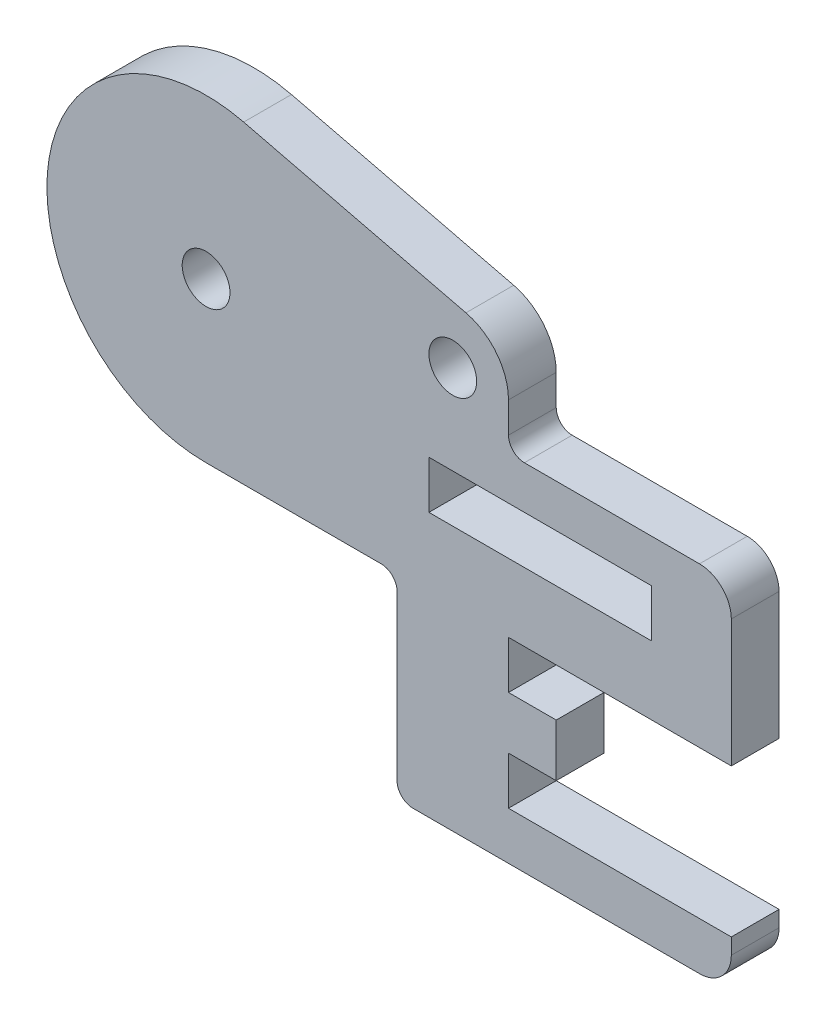
ISO-10303-21;
HEADER;
FILE_DESCRIPTION(('STEP AP214'),'2;1');
FILE_NAME('part.step','',(''),(''),'','','');
FILE_SCHEMA(('AUTOMOTIVE_DESIGN { 1 0 10303 214 1 1 1 1 }'));
ENDSEC;
DATA;
#1=APPLICATION_CONTEXT('core data for automotive mechanical design processes');
#2=APPLICATION_PROTOCOL_DEFINITION('international standard','automotive_design',2000,#1);
#3=PRODUCT_CONTEXT('',#1,'mechanical');
#4=PRODUCT('Part','Part','',(#3));
#5=PRODUCT_RELATED_PRODUCT_CATEGORY('part','',(#4));
#6=PRODUCT_DEFINITION_FORMATION('','',#4);
#7=PRODUCT_DEFINITION_CONTEXT('part definition',#1,'design');
#8=PRODUCT_DEFINITION('design','',#6,#7);
#9=PRODUCT_DEFINITION_SHAPE('','',#8);
#10=(LENGTH_UNIT() NAMED_UNIT(*) SI_UNIT(.MILLI.,.METRE.));
#11=(NAMED_UNIT(*) PLANE_ANGLE_UNIT() SI_UNIT($,.RADIAN.));
#12=(NAMED_UNIT(*) SI_UNIT($,.STERADIAN.) SOLID_ANGLE_UNIT());
#13=UNCERTAINTY_MEASURE_WITH_UNIT(LENGTH_MEASURE(1.E-05),#10,'distance_accuracy_value','');
#14=(GEOMETRIC_REPRESENTATION_CONTEXT(3) GLOBAL_UNCERTAINTY_ASSIGNED_CONTEXT((#13)) GLOBAL_UNIT_ASSIGNED_CONTEXT((#10,
#11,#12)) REPRESENTATION_CONTEXT('',''));
#15=CARTESIAN_POINT('',(0.,0.,0.));
#16=DIRECTION('',(0.,0.,1.));
#17=DIRECTION('',(1.,0.,0.));
#18=AXIS2_PLACEMENT_3D('',#15,#16,#17);
#19=CARTESIAN_POINT('',(3.8221752825364,-5.14990031947539,3.));
#20=DIRECTION('',(-1.,0.,0.));
#21=DIRECTION('',(0.,-1.,0.));
#22=AXIS2_PLACEMENT_3D('',#19,#20,#21);
#23=PLANE('',#22);
#24=DIRECTION('',(0.,1.,0.));
#25=VECTOR('',#24,1.);
#26=CARTESIAN_POINT('',(3.8221752825364,-5.14990031947539,0.));
#27=LINE('',#26,#25);
#28=CARTESIAN_POINT('',(3.8221752825364,-23.4499003194754,0.));
#29=VERTEX_POINT('',#28);
#30=CARTESIAN_POINT('',(3.8221752825364,-22.4499003194754,0.));
#31=VERTEX_POINT('',#30);
#32=EDGE_CURVE('E333',#29,#31,#27,.T.);
#33=ORIENTED_EDGE('',*,*,#32,.T.);
#34=DIRECTION('',(0.,0.,1.));
#35=VECTOR('',#34,1.);
#36=CARTESIAN_POINT('',(3.8221752825364,-22.4499003194754,0.));
#37=LINE('',#36,#35);
#38=CARTESIAN_POINT('',(3.8221752825364,-22.4499003194754,3.));
#39=VERTEX_POINT('',#38);
#40=EDGE_CURVE('E554',#31,#39,#37,.T.);
#41=ORIENTED_EDGE('',*,*,#40,.T.);
#42=DIRECTION('',(0.,1.,0.));
#43=VECTOR('',#42,1.);
#44=CARTESIAN_POINT('',(3.8221752825364,-5.14990031947539,3.));
#45=LINE('',#44,#43);
#46=CARTESIAN_POINT('',(3.8221752825364,-23.4499003194754,3.));
#47=VERTEX_POINT('',#46);
#48=EDGE_CURVE('E288',#47,#39,#45,.T.);
#49=ORIENTED_EDGE('',*,*,#48,.F.);
#50=DIRECTION('',(0.,0.,-1.));
#51=VECTOR('',#50,1.);
#52=CARTESIAN_POINT('',(3.8221752825364,-23.4499003194754,3.));
#53=LINE('',#52,#51);
#54=EDGE_CURVE('E381',#47,#29,#53,.T.);
#55=ORIENTED_EDGE('',*,*,#54,.T.);
#56=EDGE_LOOP('',(#33,#41,#49,#55));
#57=FACE_BOUND('',#56,.T.);
#58=ADVANCED_FACE('F44',(#57),#23,.F.);
#59=CARTESIAN_POINT('',(-29.1778247174636,-3.14990031947539,3.));
#60=DIRECTION('',(0.,0.,-1.));
#61=DIRECTION('',(-1.,0.,0.));
#62=AXIS2_PLACEMENT_3D('',#59,#60,#61);
#63=CYLINDRICAL_SURFACE('',#62,10.);
#64=CARTESIAN_POINT('',(-29.1778247174636,-3.14990031947539,0.));
#65=DIRECTION('',(0.,0.,1.));
#66=DIRECTION('',(1.,0.,0.));
#67=AXIS2_PLACEMENT_3D('',#64,#65,#66);
#68=CIRCLE('',#67,10.);
#69=CARTESIAN_POINT('',(-26.8147949891367,6.56689393084417,0.));
#70=VERTEX_POINT('',#69);
#71=CARTESIAN_POINT('',(-29.1778247174636,-13.1499003194754,0.));
#72=VERTEX_POINT('',#71);
#73=EDGE_CURVE('E258',#70,#72,#68,.T.);
#74=ORIENTED_EDGE('',*,*,#73,.T.);
#75=DIRECTION('',(0.,0.,-1.));
#76=VECTOR('',#75,1.);
#77=CARTESIAN_POINT('',(-29.1778247174636,-13.1499003194754,3.));
#78=LINE('',#77,#76);
#79=CARTESIAN_POINT('',(-29.1778247174636,-13.1499003194754,3.));
#80=VERTEX_POINT('',#79);
#81=EDGE_CURVE('E11',#80,#72,#78,.T.);
#82=ORIENTED_EDGE('',*,*,#81,.F.);
#83=CARTESIAN_POINT('',(-29.1778247174636,-3.14990031947539,3.));
#84=DIRECTION('',(0.,0.,1.));
#85=DIRECTION('',(1.,0.,0.));
#86=AXIS2_PLACEMENT_3D('',#83,#84,#85);
#87=CIRCLE('',#86,10.);
#88=CARTESIAN_POINT('',(-26.8147949891367,6.56689393084417,3.));
#89=VERTEX_POINT('',#88);
#90=EDGE_CURVE('E264',#89,#80,#87,.T.);
#91=ORIENTED_EDGE('',*,*,#90,.F.);
#92=DIRECTION('',(0.,0.,-1.));
#93=VECTOR('',#92,1.);
#94=CARTESIAN_POINT('',(-26.8147949891367,6.56689393084417,3.));
#95=LINE('',#94,#93);
#96=EDGE_CURVE('E310',#89,#70,#95,.T.);
#97=ORIENTED_EDGE('',*,*,#96,.T.);
#98=EDGE_LOOP('',(#74,#82,#91,#97));
#99=FACE_BOUND('',#98,.T.);
#100=ADVANCED_FACE('F46',(#99),#63,.T.);
#101=CARTESIAN_POINT('',(-29.1778247174636,-13.1499003194754,3.));
#102=DIRECTION('',(0.,1.,0.));
#103=DIRECTION('',(0.,0.,1.));
#104=AXIS2_PLACEMENT_3D('',#101,#102,#103);
#105=PLANE('',#104);
#106=DIRECTION('',(1.,0.,0.));
#107=VECTOR('',#106,1.);
#108=CARTESIAN_POINT('',(-29.1778247174636,-13.1499003194754,0.));
#109=LINE('',#108,#107);
#110=CARTESIAN_POINT('',(-18.1778247174636,-13.1499003194754,0.));
#111=VERTEX_POINT('',#110);
#112=EDGE_CURVE('E314',#72,#111,#109,.T.);
#113=ORIENTED_EDGE('',*,*,#112,.T.);
#114=DIRECTION('',(0.,0.,-1.));
#115=VECTOR('',#114,1.);
#116=CARTESIAN_POINT('',(-18.1778247174636,-13.1499003194754,3.));
#117=LINE('',#116,#115);
#118=CARTESIAN_POINT('',(-18.1778247174636,-13.1499003194754,3.));
#119=VERTEX_POINT('',#118);
#120=EDGE_CURVE('E53',#119,#111,#117,.T.);
#121=ORIENTED_EDGE('',*,*,#120,.F.);
#122=DIRECTION('',(1.,0.,0.));
#123=VECTOR('',#122,1.);
#124=CARTESIAN_POINT('',(-29.1778247174636,-13.1499003194754,3.));
#125=LINE('',#124,#123);
#126=EDGE_CURVE('E268',#80,#119,#125,.T.);
#127=ORIENTED_EDGE('',*,*,#126,.F.);
#128=ORIENTED_EDGE('',*,*,#81,.T.);
#129=EDGE_LOOP('',(#113,#121,#127,#128));
#130=FACE_BOUND('',#129,.T.);
#131=ADVANCED_FACE('F428',(#130),#105,.F.);
#132=CARTESIAN_POINT('',(-18.1778247174636,-14.1499003194754,3.));
#133=DIRECTION('',(0.,0.,-1.));
#134=DIRECTION('',(-1.,0.,0.));
#135=AXIS2_PLACEMENT_3D('',#132,#133,#134);
#136=CYLINDRICAL_SURFACE('',#135,1.);
#137=CARTESIAN_POINT('',(-18.1778247174636,-14.1499003194754,0.));
#138=DIRECTION('',(0.,0.,-1.));
#139=DIRECTION('',(-1.,0.,0.));
#140=AXIS2_PLACEMENT_3D('',#137,#138,#139);
#141=CIRCLE('',#140,1.);
#142=CARTESIAN_POINT('',(-17.1778247174636,-14.1499003194754,0.));
#143=VERTEX_POINT('',#142);
#144=EDGE_CURVE('E317',#111,#143,#141,.T.);
#145=ORIENTED_EDGE('',*,*,#144,.T.);
#146=DIRECTION('',(0.,0.,-1.));
#147=VECTOR('',#146,1.);
#148=CARTESIAN_POINT('',(-17.1778247174636,-14.1499003194754,3.));
#149=LINE('',#148,#147);
#150=CARTESIAN_POINT('',(-17.1778247174636,-14.1499003194754,3.));
#151=VERTEX_POINT('',#150);
#152=EDGE_CURVE('E397',#151,#143,#149,.T.);
#153=ORIENTED_EDGE('',*,*,#152,.F.);
#154=CARTESIAN_POINT('',(-18.1778247174636,-14.1499003194754,3.));
#155=DIRECTION('',(0.,0.,-1.));
#156=DIRECTION('',(-1.,0.,0.));
#157=AXIS2_PLACEMENT_3D('',#154,#155,#156);
#158=CIRCLE('',#157,1.);
#159=EDGE_CURVE('E272',#119,#151,#158,.T.);
#160=ORIENTED_EDGE('',*,*,#159,.F.);
#161=ORIENTED_EDGE('',*,*,#120,.T.);
#162=EDGE_LOOP('',(#145,#153,#160,#161));
#163=FACE_BOUND('',#162,.T.);
#164=ADVANCED_FACE('F406',(#163),#136,.F.);
#165=CARTESIAN_POINT('',(-17.1778247174636,-24.4499003194754,3.));
#166=DIRECTION('',(1.,0.,0.));
#167=DIRECTION('',(0.,0.,-1.));
#168=AXIS2_PLACEMENT_3D('',#165,#166,#167);
#169=PLANE('',#168);
#170=DIRECTION('',(0.,-1.,0.));
#171=VECTOR('',#170,1.);
#172=CARTESIAN_POINT('',(-17.1778247174636,-24.4499003194754,0.));
#173=LINE('',#172,#171);
#174=CARTESIAN_POINT('',(-17.1778247174636,-24.4499003194754,0.));
#175=VERTEX_POINT('',#174);
#176=EDGE_CURVE('E320',#143,#175,#173,.T.);
#177=ORIENTED_EDGE('',*,*,#176,.T.);
#178=DIRECTION('',(0.,0.,-1.));
#179=VECTOR('',#178,1.);
#180=CARTESIAN_POINT('',(-17.1778247174636,-24.4499003194754,3.));
#181=LINE('',#180,#179);
#182=CARTESIAN_POINT('',(-17.1778247174636,-24.4499003194754,3.));
#183=VERTEX_POINT('',#182);
#184=EDGE_CURVE('E393',#183,#175,#181,.T.);
#185=ORIENTED_EDGE('',*,*,#184,.F.);
#186=DIRECTION('',(0.,-1.,0.));
#187=VECTOR('',#186,1.);
#188=CARTESIAN_POINT('',(-17.1778247174636,-24.4499003194754,3.));
#189=LINE('',#188,#187);
#190=EDGE_CURVE('E275',#151,#183,#189,.T.);
#191=ORIENTED_EDGE('',*,*,#190,.F.);
#192=ORIENTED_EDGE('',*,*,#152,.T.);
#193=EDGE_LOOP('',(#177,#185,#191,#192));
#194=FACE_BOUND('',#193,.T.);
#195=ADVANCED_FACE('F415',(#194),#169,.F.);
#196=CARTESIAN_POINT('',(-16.1778247174636,-24.4499003194754,3.));
#197=DIRECTION('',(0.,0.,-1.));
#198=DIRECTION('',(-1.,0.,0.));
#199=AXIS2_PLACEMENT_3D('',#196,#197,#198);
#200=CYLINDRICAL_SURFACE('',#199,1.);
#201=CARTESIAN_POINT('',(-16.1778247174636,-24.4499003194754,0.));
#202=DIRECTION('',(0.,0.,1.));
#203=DIRECTION('',(1.,0.,0.));
#204=AXIS2_PLACEMENT_3D('',#201,#202,#203);
#205=CIRCLE('',#204,1.);
#206=CARTESIAN_POINT('',(-16.1778247174636,-25.4499003194754,0.));
#207=VERTEX_POINT('',#206);
#208=EDGE_CURVE('E323',#175,#207,#205,.T.);
#209=ORIENTED_EDGE('',*,*,#208,.T.);
#210=DIRECTION('',(0.,0.,-1.));
#211=VECTOR('',#210,1.);
#212=CARTESIAN_POINT('',(-16.1778247174636,-25.4499003194754,3.));
#213=LINE('',#212,#211);
#214=CARTESIAN_POINT('',(-16.1778247174636,-25.4499003194754,3.));
#215=VERTEX_POINT('',#214);
#216=EDGE_CURVE('E389',#215,#207,#213,.T.);
#217=ORIENTED_EDGE('',*,*,#216,.F.);
#218=CARTESIAN_POINT('',(-16.1778247174636,-24.4499003194754,3.));
#219=DIRECTION('',(0.,0.,1.));
#220=DIRECTION('',(1.,0.,0.));
#221=AXIS2_PLACEMENT_3D('',#218,#219,#220);
#222=CIRCLE('',#221,1.);
#223=EDGE_CURVE('E278',#183,#215,#222,.T.);
#224=ORIENTED_EDGE('',*,*,#223,.F.);
#225=ORIENTED_EDGE('',*,*,#184,.T.);
#226=EDGE_LOOP('',(#209,#217,#224,#225));
#227=FACE_BOUND('',#226,.T.);
#228=ADVANCED_FACE('F419',(#227),#200,.T.);
#229=CARTESIAN_POINT('',(1.8221752825364,-25.4499003194754,3.));
#230=DIRECTION('',(0.,1.,0.));
#231=DIRECTION('',(-1.,0.,0.));
#232=AXIS2_PLACEMENT_3D('',#229,#230,#231);
#233=PLANE('',#232);
#234=DIRECTION('',(1.,0.,0.));
#235=VECTOR('',#234,1.);
#236=CARTESIAN_POINT('',(1.8221752825364,-25.4499003194754,0.));
#237=LINE('',#236,#235);
#238=CARTESIAN_POINT('',(1.8221752825364,-25.4499003194754,0.));
#239=VERTEX_POINT('',#238);
#240=EDGE_CURVE('E326',#207,#239,#237,.T.);
#241=ORIENTED_EDGE('',*,*,#240,.T.);
#242=DIRECTION('',(0.,0.,-1.));
#243=VECTOR('',#242,1.);
#244=CARTESIAN_POINT('',(1.8221752825364,-25.4499003194754,3.));
#245=LINE('',#244,#243);
#246=CARTESIAN_POINT('',(1.8221752825364,-25.4499003194754,3.));
#247=VERTEX_POINT('',#246);
#248=EDGE_CURVE('E385',#247,#239,#245,.T.);
#249=ORIENTED_EDGE('',*,*,#248,.F.);
#250=DIRECTION('',(1.,0.,0.));
#251=VECTOR('',#250,1.);
#252=CARTESIAN_POINT('',(1.8221752825364,-25.4499003194754,3.));
#253=LINE('',#252,#251);
#254=EDGE_CURVE('E281',#215,#247,#253,.T.);
#255=ORIENTED_EDGE('',*,*,#254,.F.);
#256=ORIENTED_EDGE('',*,*,#216,.T.);
#257=EDGE_LOOP('',(#241,#249,#255,#256));
#258=FACE_BOUND('',#257,.T.);
#259=ADVANCED_FACE('F611',(#258),#233,.F.);
#260=CARTESIAN_POINT('',(1.8221752825364,-23.4499003194754,3.));
#261=DIRECTION('',(0.,0.,-1.));
#262=DIRECTION('',(-1.,0.,0.));
#263=AXIS2_PLACEMENT_3D('',#260,#261,#262);
#264=CYLINDRICAL_SURFACE('',#263,2.);
#265=CARTESIAN_POINT('',(1.8221752825364,-23.4499003194754,0.));
#266=DIRECTION('',(0.,0.,1.));
#267=DIRECTION('',(-1.,0.,0.));
#268=AXIS2_PLACEMENT_3D('',#265,#266,#267);
#269=CIRCLE('',#268,2.);
#270=EDGE_CURVE('E329',#239,#29,#269,.T.);
#271=ORIENTED_EDGE('',*,*,#270,.T.);
#272=ORIENTED_EDGE('',*,*,#54,.F.);
#273=CARTESIAN_POINT('',(1.8221752825364,-23.4499003194754,3.));
#274=DIRECTION('',(0.,0.,1.));
#275=DIRECTION('',(-1.,0.,0.));
#276=AXIS2_PLACEMENT_3D('',#273,#274,#275);
#277=CIRCLE('',#276,2.);
#278=EDGE_CURVE('E284',#247,#47,#277,.T.);
#279=ORIENTED_EDGE('',*,*,#278,.F.);
#280=ORIENTED_EDGE('',*,*,#248,.T.);
#281=EDGE_LOOP('',(#271,#272,#279,#280));
#282=FACE_BOUND('',#281,.T.);
#283=ADVANCED_FACE('F605',(#282),#264,.T.);
#284=CARTESIAN_POINT('',(3.8221752825364,-13.1499003194754,3.));
#285=VERTEX_POINT('',#284);
#286=CARTESIAN_POINT('',(3.8221752825364,-5.14990031947539,3.));
#287=VERTEX_POINT('',#286);
#288=EDGE_CURVE('E287',#285,#287,#45,.T.);
#289=ORIENTED_EDGE('',*,*,#288,.F.);
#290=DIRECTION('',(0.,0.,1.));
#291=VECTOR('',#290,1.);
#292=CARTESIAN_POINT('',(3.8221752825364,-13.1499003194754,0.));
#293=LINE('',#292,#291);
#294=CARTESIAN_POINT('',(3.8221752825364,-13.1499003194754,0.));
#295=VERTEX_POINT('',#294);
#296=EDGE_CURVE('E527',#295,#285,#293,.T.);
#297=ORIENTED_EDGE('',*,*,#296,.F.);
#298=CARTESIAN_POINT('',(3.8221752825364,-5.14990031947539,0.));
#299=VERTEX_POINT('',#298);
#300=EDGE_CURVE('E332',#295,#299,#27,.T.);
#301=ORIENTED_EDGE('',*,*,#300,.T.);
#302=DIRECTION('',(0.,0.,-1.));
#303=VECTOR('',#302,1.);
#304=CARTESIAN_POINT('',(3.8221752825364,-5.14990031947539,3.));
#305=LINE('',#304,#303);
#306=EDGE_CURVE('E377',#287,#299,#305,.T.);
#307=ORIENTED_EDGE('',*,*,#306,.F.);
#308=EDGE_LOOP('',(#289,#297,#301,#307));
#309=FACE_BOUND('',#308,.T.);
#310=ADVANCED_FACE('F583',(#309),#23,.F.);
#311=CARTESIAN_POINT('',(1.8221752825364,-5.14990031947539,3.));
#312=DIRECTION('',(0.,0.,-1.));
#313=DIRECTION('',(-1.,0.,0.));
#314=AXIS2_PLACEMENT_3D('',#311,#312,#313);
#315=CYLINDRICAL_SURFACE('',#314,2.);
#316=CARTESIAN_POINT('',(1.8221752825364,-5.14990031947539,0.));
#317=DIRECTION('',(0.,0.,1.));
#318=DIRECTION('',(-1.,0.,0.));
#319=AXIS2_PLACEMENT_3D('',#316,#317,#318);
#320=CIRCLE('',#319,2.);
#321=CARTESIAN_POINT('',(1.8221752825364,-3.14990031947539,0.));
#322=VERTEX_POINT('',#321);
#323=EDGE_CURVE('E337',#299,#322,#320,.T.);
#324=ORIENTED_EDGE('',*,*,#323,.T.);
#325=DIRECTION('',(0.,0.,-1.));
#326=VECTOR('',#325,1.);
#327=CARTESIAN_POINT('',(1.8221752825364,-3.14990031947539,3.));
#328=LINE('',#327,#326);
#329=CARTESIAN_POINT('',(1.8221752825364,-3.14990031947539,3.));
#330=VERTEX_POINT('',#329);
#331=EDGE_CURVE('E373',#330,#322,#328,.T.);
#332=ORIENTED_EDGE('',*,*,#331,.F.);
#333=CARTESIAN_POINT('',(1.8221752825364,-5.14990031947539,3.));
#334=DIRECTION('',(0.,0.,1.));
#335=DIRECTION('',(-1.,0.,0.));
#336=AXIS2_PLACEMENT_3D('',#333,#334,#335);
#337=CIRCLE('',#336,2.);
#338=EDGE_CURVE('E292',#287,#330,#337,.T.);
#339=ORIENTED_EDGE('',*,*,#338,.F.);
#340=ORIENTED_EDGE('',*,*,#306,.T.);
#341=EDGE_LOOP('',(#324,#332,#339,#340));
#342=FACE_BOUND('',#341,.T.);
#343=ADVANCED_FACE('F459',(#342),#315,.T.);
#344=CARTESIAN_POINT('',(-9.1778247174636,-3.14990031947539,3.));
#345=DIRECTION('',(0.,-1.,0.));
#346=DIRECTION('',(1.,0.,0.));
#347=AXIS2_PLACEMENT_3D('',#344,#345,#346);
#348=PLANE('',#347);
#349=DIRECTION('',(-1.,0.,0.));
#350=VECTOR('',#349,1.);
#351=CARTESIAN_POINT('',(-9.1778247174636,-3.14990031947539,0.));
#352=LINE('',#351,#350);
#353=CARTESIAN_POINT('',(-9.1778247174636,-3.14990031947539,0.));
#354=VERTEX_POINT('',#353);
#355=EDGE_CURVE('E340',#322,#354,#352,.T.);
#356=ORIENTED_EDGE('',*,*,#355,.T.);
#357=DIRECTION('',(0.,0.,-1.));
#358=VECTOR('',#357,1.);
#359=CARTESIAN_POINT('',(-9.1778247174636,-3.14990031947539,3.));
#360=LINE('',#359,#358);
#361=CARTESIAN_POINT('',(-9.1778247174636,-3.14990031947539,3.));
#362=VERTEX_POINT('',#361);
#363=EDGE_CURVE('E369',#362,#354,#360,.T.);
#364=ORIENTED_EDGE('',*,*,#363,.F.);
#365=DIRECTION('',(-1.,0.,0.));
#366=VECTOR('',#365,1.);
#367=CARTESIAN_POINT('',(-9.1778247174636,-3.14990031947539,3.));
#368=LINE('',#367,#366);
#369=EDGE_CURVE('E295',#330,#362,#368,.T.);
#370=ORIENTED_EDGE('',*,*,#369,.F.);
#371=ORIENTED_EDGE('',*,*,#331,.T.);
#372=EDGE_LOOP('',(#356,#364,#370,#371));
#373=FACE_BOUND('',#372,.T.);
#374=ADVANCED_FACE('F455',(#373),#348,.F.);
#375=CARTESIAN_POINT('',(-9.1778247174636,-2.14990031947539,3.));
#376=DIRECTION('',(0.,0.,-1.));
#377=DIRECTION('',(-1.,0.,0.));
#378=AXIS2_PLACEMENT_3D('',#375,#376,#377);
#379=CYLINDRICAL_SURFACE('',#378,1.);
#380=CARTESIAN_POINT('',(-9.1778247174636,-2.14990031947539,0.));
#381=DIRECTION('',(0.,0.,-1.));
#382=DIRECTION('',(-1.,0.,0.));
#383=AXIS2_PLACEMENT_3D('',#380,#381,#382);
#384=CIRCLE('',#383,1.);
#385=CARTESIAN_POINT('',(-10.1778247174636,-2.14990031947539,0.));
#386=VERTEX_POINT('',#385);
#387=EDGE_CURVE('E343',#354,#386,#384,.T.);
#388=ORIENTED_EDGE('',*,*,#387,.T.);
#389=DIRECTION('',(0.,0.,-1.));
#390=VECTOR('',#389,1.);
#391=CARTESIAN_POINT('',(-10.1778247174636,-2.14990031947539,3.));
#392=LINE('',#391,#390);
#393=CARTESIAN_POINT('',(-10.1778247174636,-2.14990031947539,3.));
#394=VERTEX_POINT('',#393);
#395=EDGE_CURVE('E365',#394,#386,#392,.T.);
#396=ORIENTED_EDGE('',*,*,#395,.F.);
#397=CARTESIAN_POINT('',(-9.1778247174636,-2.14990031947539,3.));
#398=DIRECTION('',(0.,0.,-1.));
#399=DIRECTION('',(-1.,0.,0.));
#400=AXIS2_PLACEMENT_3D('',#397,#398,#399);
#401=CIRCLE('',#400,1.);
#402=EDGE_CURVE('E298',#362,#394,#401,.T.);
#403=ORIENTED_EDGE('',*,*,#402,.F.);
#404=ORIENTED_EDGE('',*,*,#363,.T.);
#405=EDGE_LOOP('',(#388,#396,#403,#404));
#406=FACE_BOUND('',#405,.T.);
#407=ADVANCED_FACE('F450',(#406),#379,.F.);
#408=CARTESIAN_POINT('',(-10.1778247174636,-2.14990031947539,3.));
#409=DIRECTION('',(-1.,0.,0.));
#410=DIRECTION('',(0.,0.,1.));
#411=AXIS2_PLACEMENT_3D('',#408,#409,#410);
#412=PLANE('',#411);
#413=DIRECTION('',(0.,1.,0.));
#414=VECTOR('',#413,1.);
#415=CARTESIAN_POINT('',(-10.1778247174636,-2.14990031947539,0.));
#416=LINE('',#415,#414);
#417=CARTESIAN_POINT('',(-10.1778247174636,-0.229900319475391,0.));
#418=VERTEX_POINT('',#417);
#419=EDGE_CURVE('E346',#386,#418,#416,.T.);
#420=ORIENTED_EDGE('',*,*,#419,.T.);
#421=DIRECTION('',(0.,0.,-1.));
#422=VECTOR('',#421,1.);
#423=CARTESIAN_POINT('',(-10.1778247174636,-0.229900319475391,3.));
#424=LINE('',#423,#422);
#425=CARTESIAN_POINT('',(-10.1778247174636,-0.229900319475391,3.));
#426=VERTEX_POINT('',#425);
#427=EDGE_CURVE('E361',#426,#418,#424,.T.);
#428=ORIENTED_EDGE('',*,*,#427,.F.);
#429=DIRECTION('',(0.,1.,0.));
#430=VECTOR('',#429,1.);
#431=CARTESIAN_POINT('',(-10.1778247174636,-2.14990031947539,3.));
#432=LINE('',#431,#430);
#433=EDGE_CURVE('E301',#394,#426,#432,.T.);
#434=ORIENTED_EDGE('',*,*,#433,.F.);
#435=ORIENTED_EDGE('',*,*,#395,.T.);
#436=EDGE_LOOP('',(#420,#428,#434,#435));
#437=FACE_BOUND('',#436,.T.);
#438=ADVANCED_FACE('F444',(#437),#412,.F.);
#439=CARTESIAN_POINT('',(-13.6778247174636,-0.229900319475391,3.));
#440=DIRECTION('',(0.,0.,-1.));
#441=DIRECTION('',(-1.,0.,0.));
#442=AXIS2_PLACEMENT_3D('',#439,#440,#441);
#443=CYLINDRICAL_SURFACE('',#442,3.5);
#444=CARTESIAN_POINT('',(-13.6778247174636,-0.229900319475391,0.));
#445=DIRECTION('',(0.,0.,1.));
#446=DIRECTION('',(1.,0.,0.));
#447=AXIS2_PLACEMENT_3D('',#444,#445,#446);
#448=CIRCLE('',#447,3.5);
#449=CARTESIAN_POINT('',(-12.8507643125492,3.17097766813646,0.));
#450=VERTEX_POINT('',#449);
#451=EDGE_CURVE('E349',#418,#450,#448,.T.);
#452=ORIENTED_EDGE('',*,*,#451,.T.);
#453=DIRECTION('',(0.,0.,-1.));
#454=VECTOR('',#453,1.);
#455=CARTESIAN_POINT('',(-12.8507643125492,3.17097766813646,3.));
#456=LINE('',#455,#454);
#457=CARTESIAN_POINT('',(-12.8507643125492,3.17097766813646,3.));
#458=VERTEX_POINT('',#457);
#459=EDGE_CURVE('E357',#458,#450,#456,.T.);
#460=ORIENTED_EDGE('',*,*,#459,.F.);
#461=CARTESIAN_POINT('',(-13.6778247174636,-0.229900319475391,3.));
#462=DIRECTION('',(0.,0.,1.));
#463=DIRECTION('',(1.,0.,0.));
#464=AXIS2_PLACEMENT_3D('',#461,#462,#463);
#465=CIRCLE('',#464,3.5);
#466=EDGE_CURVE('E304',#426,#458,#465,.T.);
#467=ORIENTED_EDGE('',*,*,#466,.F.);
#468=ORIENTED_EDGE('',*,*,#427,.T.);
#469=EDGE_LOOP('',(#452,#460,#467,#468));
#470=FACE_BOUND('',#469,.T.);
#471=ADVANCED_FACE('F440',(#470),#443,.T.);
#472=CARTESIAN_POINT('',(-26.8147949891367,6.56689393084417,3.));
#473=DIRECTION('',(-0.23630297283269,-0.971679425031956,0.));
#474=DIRECTION('',(0.971679425031956,-0.23630297283269,0.));
#475=AXIS2_PLACEMENT_3D('',#472,#473,#474);
#476=PLANE('',#475);
#477=DIRECTION('',(-0.971679425031956,0.23630297283269,0.));
#478=VECTOR('',#477,1.);
#479=CARTESIAN_POINT('',(-26.8147949891367,6.56689393084417,0.));
#480=LINE('',#479,#478);
#481=EDGE_CURVE('E269',#450,#70,#480,.T.);
#482=ORIENTED_EDGE('',*,*,#481,.T.);
#483=ORIENTED_EDGE('',*,*,#96,.F.);
#484=DIRECTION('',(-0.971679425031956,0.23630297283269,0.));
#485=VECTOR('',#484,1.);
#486=CARTESIAN_POINT('',(-26.8147949891367,6.56689393084417,3.));
#487=LINE('',#486,#485);
#488=EDGE_CURVE('E307',#458,#89,#487,.T.);
#489=ORIENTED_EDGE('',*,*,#488,.F.);
#490=ORIENTED_EDGE('',*,*,#459,.T.);
#491=EDGE_LOOP('',(#482,#483,#489,#490));
#492=FACE_BOUND('',#491,.T.);
#493=ADVANCED_FACE('F435',(#492),#476,.F.);
#494=CARTESIAN_POINT('',(-29.1778247174636,-3.14990031947539,3.));
#495=DIRECTION('',(0.,0.,1.));
#496=DIRECTION('',(1.,0.,0.));
#497=AXIS2_PLACEMENT_3D('',#494,#495,#496);
#498=PLANE('',#497);
#499=DIRECTION('',(0.,-1.,0.));
#500=VECTOR('',#499,1.);
#501=CARTESIAN_POINT('',(-7.1778247174636,-16.1499003194754,3.));
#502=LINE('',#501,#500);
#503=CARTESIAN_POINT('',(-7.1778247174636,-16.1499003194754,3.));
#504=VERTEX_POINT('',#503);
#505=CARTESIAN_POINT('',(-7.1778247174636,-19.4499003194754,3.));
#506=VERTEX_POINT('',#505);
#507=EDGE_CURVE('E219',#504,#506,#502,.T.);
#508=ORIENTED_EDGE('',*,*,#507,.F.);
#509=DIRECTION('',(1.,0.,0.));
#510=VECTOR('',#509,1.);
#511=CARTESIAN_POINT('',(-10.1778247174636,-16.1499003194754,3.));
#512=LINE('',#511,#510);
#513=CARTESIAN_POINT('',(-10.1778247174636,-16.1499003194754,3.));
#514=VERTEX_POINT('',#513);
#515=EDGE_CURVE('E516',#514,#504,#512,.T.);
#516=ORIENTED_EDGE('',*,*,#515,.F.);
#517=DIRECTION('',(0.,-1.,0.));
#518=VECTOR('',#517,1.);
#519=CARTESIAN_POINT('',(-10.1778247174636,-13.1499003194754,3.));
#520=LINE('',#519,#518);
#521=CARTESIAN_POINT('',(-10.1778247174636,-13.1499003194754,3.));
#522=VERTEX_POINT('',#521);
#523=EDGE_CURVE('E512',#522,#514,#520,.T.);
#524=ORIENTED_EDGE('',*,*,#523,.F.);
#525=DIRECTION('',(-1.,0.,0.));
#526=VECTOR('',#525,1.);
#527=CARTESIAN_POINT('',(3.8221752825364,-13.1499003194754,3.));
#528=LINE('',#527,#526);
#529=EDGE_CURVE('E508',#285,#522,#528,.T.);
#530=ORIENTED_EDGE('',*,*,#529,.F.);
#531=ORIENTED_EDGE('',*,*,#288,.T.);
#532=ORIENTED_EDGE('',*,*,#338,.T.);
#533=ORIENTED_EDGE('',*,*,#369,.T.);
#534=ORIENTED_EDGE('',*,*,#402,.T.);
#535=ORIENTED_EDGE('',*,*,#433,.T.);
#536=ORIENTED_EDGE('',*,*,#466,.T.);
#537=ORIENTED_EDGE('',*,*,#488,.T.);
#538=ORIENTED_EDGE('',*,*,#90,.T.);
#539=ORIENTED_EDGE('',*,*,#126,.T.);
#540=ORIENTED_EDGE('',*,*,#159,.T.);
#541=ORIENTED_EDGE('',*,*,#190,.T.);
#542=ORIENTED_EDGE('',*,*,#223,.T.);
#543=ORIENTED_EDGE('',*,*,#254,.T.);
#544=ORIENTED_EDGE('',*,*,#278,.T.);
#545=ORIENTED_EDGE('',*,*,#48,.T.);
#546=DIRECTION('',(1.,0.,0.));
#547=VECTOR('',#546,1.);
#548=CARTESIAN_POINT('',(3.8221752825364,-22.4499003194754,3.));
#549=LINE('',#548,#547);
#550=CARTESIAN_POINT('',(-10.1778247174636,-22.4499003194754,3.));
#551=VERTEX_POINT('',#550);
#552=EDGE_CURVE('E243',#551,#39,#549,.T.);
#553=ORIENTED_EDGE('',*,*,#552,.F.);
#554=DIRECTION('',(0.,-1.,0.));
#555=VECTOR('',#554,1.);
#556=CARTESIAN_POINT('',(-10.1778247174636,-19.4499003194754,3.));
#557=LINE('',#556,#555);
#558=CARTESIAN_POINT('',(-10.1778247174636,-19.4499003194754,3.));
#559=VERTEX_POINT('',#558);
#560=EDGE_CURVE('E248',#559,#551,#557,.T.);
#561=ORIENTED_EDGE('',*,*,#560,.F.);
#562=DIRECTION('',(-1.,0.,0.));
#563=VECTOR('',#562,1.);
#564=CARTESIAN_POINT('',(3.8221752825364,-19.4499003194754,3.));
#565=LINE('',#564,#563);
#566=EDGE_CURVE('E536',#506,#559,#565,.T.);
#567=ORIENTED_EDGE('',*,*,#566,.F.);
#568=EDGE_LOOP('',(#508,#516,#524,#530,#531,#532,#533,#534,#535,#536,#537,#538,#539,#540,#541,
#542,#543,#544,#545,#553,#561,#567));
#569=FACE_BOUND('',#568,.T.);
#570=CARTESIAN_POINT('',(-13.6778247174636,-0.229900319475391,3.));
#571=DIRECTION('',(0.,0.,1.));
#572=DIRECTION('',(1.,0.,0.));
#573=AXIS2_PLACEMENT_3D('',#570,#571,#572);
#574=CIRCLE('',#573,1.5);
#575=CARTESIAN_POINT('',(-12.1778247174636,-0.229900319475391,3.));
#576=VERTEX_POINT('',#575);
#577=EDGE_CURVE('E224',#576,#576,#574,.T.);
#578=ORIENTED_EDGE('',*,*,#577,.F.);
#579=EDGE_LOOP('',(#578));
#580=FACE_BOUND('',#579,.T.);
#581=DIRECTION('',(0.,1.,0.));
#582=VECTOR('',#581,1.);
#583=CARTESIAN_POINT('',(-1.1778247174636,-8.84990031947539,3.));
#584=LINE('',#583,#582);
#585=CARTESIAN_POINT('',(-1.1778247174636,-8.84990031947539,3.));
#586=VERTEX_POINT('',#585);
#587=CARTESIAN_POINT('',(-1.1778247174636,-5.84990031947539,3.));
#588=VERTEX_POINT('',#587);
#589=EDGE_CURVE('E68',#586,#588,#584,.T.);
#590=ORIENTED_EDGE('',*,*,#589,.F.);
#591=DIRECTION('',(1.,0.,0.));
#592=VECTOR('',#591,1.);
#593=CARTESIAN_POINT('',(-1.1778247174636,-8.84990031947539,3.));
#594=LINE('',#593,#592);
#595=CARTESIAN_POINT('',(-15.1778247174636,-8.8499003194754,3.));
#596=VERTEX_POINT('',#595);
#597=EDGE_CURVE('E494',#596,#586,#594,.T.);
#598=ORIENTED_EDGE('',*,*,#597,.F.);
#599=DIRECTION('',(0.,-1.,0.));
#600=VECTOR('',#599,1.);
#601=CARTESIAN_POINT('',(-15.1778247174636,-8.8499003194754,3.));
#602=LINE('',#601,#600);
#603=CARTESIAN_POINT('',(-15.1778247174636,-5.84990031947539,3.));
#604=VERTEX_POINT('',#603);
#605=EDGE_CURVE('E498',#604,#596,#602,.T.);
#606=ORIENTED_EDGE('',*,*,#605,.F.);
#607=DIRECTION('',(-1.,0.,0.));
#608=VECTOR('',#607,1.);
#609=CARTESIAN_POINT('',(-1.1778247174636,-5.84990031947539,3.));
#610=LINE('',#609,#608);
#611=EDGE_CURVE('E502',#588,#604,#610,.T.);
#612=ORIENTED_EDGE('',*,*,#611,.F.);
#613=EDGE_LOOP('',(#590,#598,#606,#612));
#614=FACE_BOUND('',#613,.T.);
#615=CARTESIAN_POINT('',(-29.1778247174636,-3.14990031947539,3.));
#616=DIRECTION('',(0.,0.,1.));
#617=DIRECTION('',(1.,0.,0.));
#618=AXIS2_PLACEMENT_3D('',#615,#616,#617);
#619=CIRCLE('',#618,1.5);
#620=CARTESIAN_POINT('',(-27.6778247174636,-3.14990031947539,3.));
#621=VERTEX_POINT('',#620);
#622=EDGE_CURVE('E259',#621,#621,#619,.T.);
#623=ORIENTED_EDGE('',*,*,#622,.F.);
#624=EDGE_LOOP('',(#623));
#625=FACE_BOUND('',#624,.T.);
#626=ADVANCED_FACE('F423',(#569,#580,#614,#625),#498,.T.);
#627=CARTESIAN_POINT('',(-29.1778247174636,-3.14990031947539,0.));
#628=DIRECTION('',(0.,0.,1.));
#629=DIRECTION('',(1.,0.,0.));
#630=AXIS2_PLACEMENT_3D('',#627,#628,#629);
#631=PLANE('',#630);
#632=CARTESIAN_POINT('',(-13.6778247174636,-0.229900319475391,0.));
#633=DIRECTION('',(0.,0.,1.));
#634=DIRECTION('',(1.,0.,0.));
#635=AXIS2_PLACEMENT_3D('',#632,#633,#634);
#636=CIRCLE('',#635,1.5);
#637=CARTESIAN_POINT('',(-12.1778247174636,-0.229900319475391,0.));
#638=VERTEX_POINT('',#637);
#639=EDGE_CURVE('E558',#638,#638,#636,.T.);
#640=ORIENTED_EDGE('',*,*,#639,.T.);
#641=EDGE_LOOP('',(#640));
#642=FACE_BOUND('',#641,.T.);
#643=DIRECTION('',(1.,0.,0.));
#644=VECTOR('',#643,1.);
#645=CARTESIAN_POINT('',(-1.1778247174636,-8.84990031947539,0.));
#646=LINE('',#645,#644);
#647=CARTESIAN_POINT('',(-15.1778247174636,-8.8499003194754,0.));
#648=VERTEX_POINT('',#647);
#649=CARTESIAN_POINT('',(-1.1778247174636,-8.84990031947539,0.));
#650=VERTEX_POINT('',#649);
#651=EDGE_CURVE('E478',#648,#650,#646,.T.);
#652=ORIENTED_EDGE('',*,*,#651,.T.);
#653=DIRECTION('',(0.,1.,0.));
#654=VECTOR('',#653,1.);
#655=CARTESIAN_POINT('',(-1.1778247174636,-8.84990031947539,0.));
#656=LINE('',#655,#654);
#657=CARTESIAN_POINT('',(-1.1778247174636,-5.84990031947539,0.));
#658=VERTEX_POINT('',#657);
#659=EDGE_CURVE('E490',#650,#658,#656,.T.);
#660=ORIENTED_EDGE('',*,*,#659,.T.);
#661=DIRECTION('',(-1.,0.,0.));
#662=VECTOR('',#661,1.);
#663=CARTESIAN_POINT('',(-1.1778247174636,-5.84990031947539,0.));
#664=LINE('',#663,#662);
#665=CARTESIAN_POINT('',(-15.1778247174636,-5.84990031947539,0.));
#666=VERTEX_POINT('',#665);
#667=EDGE_CURVE('E486',#658,#666,#664,.T.);
#668=ORIENTED_EDGE('',*,*,#667,.T.);
#669=DIRECTION('',(0.,-1.,0.));
#670=VECTOR('',#669,1.);
#671=CARTESIAN_POINT('',(-15.1778247174636,-8.8499003194754,0.));
#672=LINE('',#671,#670);
#673=EDGE_CURVE('E482',#666,#648,#672,.T.);
#674=ORIENTED_EDGE('',*,*,#673,.T.);
#675=EDGE_LOOP('',(#652,#660,#668,#674));
#676=FACE_BOUND('',#675,.T.);
#677=CARTESIAN_POINT('',(-29.1778247174636,-3.14990031947539,0.));
#678=DIRECTION('',(0.,0.,1.));
#679=DIRECTION('',(1.,0.,0.));
#680=AXIS2_PLACEMENT_3D('',#677,#678,#679);
#681=CIRCLE('',#680,1.5);
#682=CARTESIAN_POINT('',(-27.6778247174636,-3.14990031947539,0.));
#683=VERTEX_POINT('',#682);
#684=EDGE_CURVE('E254',#683,#683,#681,.T.);
#685=ORIENTED_EDGE('',*,*,#684,.T.);
#686=EDGE_LOOP('',(#685));
#687=FACE_BOUND('',#686,.T.);
#688=DIRECTION('',(1.,0.,0.));
#689=VECTOR('',#688,1.);
#690=CARTESIAN_POINT('',(-10.1778247174636,-16.1499003194754,0.));
#691=LINE('',#690,#689);
#692=CARTESIAN_POINT('',(-10.1778247174636,-16.1499003194754,0.));
#693=VERTEX_POINT('',#692);
#694=CARTESIAN_POINT('',(-7.1778247174636,-16.1499003194754,0.));
#695=VERTEX_POINT('',#694);
#696=EDGE_CURVE('E235',#693,#695,#691,.T.);
#697=ORIENTED_EDGE('',*,*,#696,.T.);
#698=DIRECTION('',(0.,-1.,0.));
#699=VECTOR('',#698,1.);
#700=CARTESIAN_POINT('',(-7.1778247174636,-16.1499003194754,0.));
#701=LINE('',#700,#699);
#702=CARTESIAN_POINT('',(-7.1778247174636,-19.4499003194754,0.));
#703=VERTEX_POINT('',#702);
#704=EDGE_CURVE('E60',#695,#703,#701,.T.);
#705=ORIENTED_EDGE('',*,*,#704,.T.);
#706=DIRECTION('',(-1.,0.,0.));
#707=VECTOR('',#706,1.);
#708=CARTESIAN_POINT('',(3.8221752825364,-19.4499003194754,0.));
#709=LINE('',#708,#707);
#710=CARTESIAN_POINT('',(-10.1778247174636,-19.4499003194754,0.));
#711=VERTEX_POINT('',#710);
#712=EDGE_CURVE('E231',#703,#711,#709,.T.);
#713=ORIENTED_EDGE('',*,*,#712,.T.);
#714=DIRECTION('',(0.,-1.,0.));
#715=VECTOR('',#714,1.);
#716=CARTESIAN_POINT('',(-10.1778247174636,-19.4499003194754,0.));
#717=LINE('',#716,#715);
#718=CARTESIAN_POINT('',(-10.1778247174636,-22.4499003194754,0.));
#719=VERTEX_POINT('',#718);
#720=EDGE_CURVE('E244',#711,#719,#717,.T.);
#721=ORIENTED_EDGE('',*,*,#720,.T.);
#722=DIRECTION('',(1.,0.,0.));
#723=VECTOR('',#722,1.);
#724=CARTESIAN_POINT('',(3.8221752825364,-22.4499003194754,0.));
#725=LINE('',#724,#723);
#726=EDGE_CURVE('E250',#719,#31,#725,.T.);
#727=ORIENTED_EDGE('',*,*,#726,.T.);
#728=ORIENTED_EDGE('',*,*,#32,.F.);
#729=ORIENTED_EDGE('',*,*,#270,.F.);
#730=ORIENTED_EDGE('',*,*,#240,.F.);
#731=ORIENTED_EDGE('',*,*,#208,.F.);
#732=ORIENTED_EDGE('',*,*,#176,.F.);
#733=ORIENTED_EDGE('',*,*,#144,.F.);
#734=ORIENTED_EDGE('',*,*,#112,.F.);
#735=ORIENTED_EDGE('',*,*,#73,.F.);
#736=ORIENTED_EDGE('',*,*,#481,.F.);
#737=ORIENTED_EDGE('',*,*,#451,.F.);
#738=ORIENTED_EDGE('',*,*,#419,.F.);
#739=ORIENTED_EDGE('',*,*,#387,.F.);
#740=ORIENTED_EDGE('',*,*,#355,.F.);
#741=ORIENTED_EDGE('',*,*,#323,.F.);
#742=ORIENTED_EDGE('',*,*,#300,.F.);
#743=DIRECTION('',(-1.,0.,0.));
#744=VECTOR('',#743,1.);
#745=CARTESIAN_POINT('',(3.8221752825364,-13.1499003194754,0.));
#746=LINE('',#745,#744);
#747=CARTESIAN_POINT('',(-10.1778247174636,-13.1499003194754,0.));
#748=VERTEX_POINT('',#747);
#749=EDGE_CURVE('E463',#295,#748,#746,.T.);
#750=ORIENTED_EDGE('',*,*,#749,.T.);
#751=DIRECTION('',(0.,-1.,0.));
#752=VECTOR('',#751,1.);
#753=CARTESIAN_POINT('',(-10.1778247174636,-13.1499003194754,0.));
#754=LINE('',#753,#752);
#755=EDGE_CURVE('E522',#748,#693,#754,.T.);
#756=ORIENTED_EDGE('',*,*,#755,.T.);
#757=EDGE_LOOP('',(#697,#705,#713,#721,#727,#728,#729,#730,#731,#732,#733,#734,#735,#736,#737,
#738,#739,#740,#741,#742,#750,#756));
#758=FACE_BOUND('',#757,.T.);
#759=ADVANCED_FACE('F229',(#642,#676,#687,#758),#631,.F.);
#760=CARTESIAN_POINT('',(-29.1778247174636,-3.14990031947539,0.));
#761=DIRECTION('',(0.,0.,1.));
#762=DIRECTION('',(1.,0.,0.));
#763=AXIS2_PLACEMENT_3D('',#760,#761,#762);
#764=CYLINDRICAL_SURFACE('',#763,1.5);
#765=ORIENTED_EDGE('',*,*,#684,.F.);
#766=EDGE_LOOP('',(#765));
#767=FACE_BOUND('',#766,.T.);
#768=ORIENTED_EDGE('',*,*,#622,.T.);
#769=EDGE_LOOP('',(#768));
#770=FACE_BOUND('',#769,.T.);
#771=ADVANCED_FACE('F722',(#767,#770),#764,.F.);
#772=CARTESIAN_POINT('',(3.8221752825364,-22.4499003194754,0.));
#773=DIRECTION('',(0.,-1.,0.));
#774=DIRECTION('',(0.,0.,-1.));
#775=AXIS2_PLACEMENT_3D('',#772,#773,#774);
#776=PLANE('',#775);
#777=ORIENTED_EDGE('',*,*,#552,.T.);
#778=ORIENTED_EDGE('',*,*,#40,.F.);
#779=ORIENTED_EDGE('',*,*,#726,.F.);
#780=DIRECTION('',(0.,0.,1.));
#781=VECTOR('',#780,1.);
#782=CARTESIAN_POINT('',(-10.1778247174636,-22.4499003194754,0.));
#783=LINE('',#782,#781);
#784=EDGE_CURVE('E551',#719,#551,#783,.T.);
#785=ORIENTED_EDGE('',*,*,#784,.T.);
#786=EDGE_LOOP('',(#777,#778,#779,#785));
#787=FACE_BOUND('',#786,.T.);
#788=ADVANCED_FACE('F731',(#787),#776,.F.);
#789=CARTESIAN_POINT('',(-10.1778247174636,-19.4499003194754,0.));
#790=DIRECTION('',(-1.,0.,0.));
#791=DIRECTION('',(0.,0.,1.));
#792=AXIS2_PLACEMENT_3D('',#789,#790,#791);
#793=PLANE('',#792);
#794=ORIENTED_EDGE('',*,*,#560,.T.);
#795=ORIENTED_EDGE('',*,*,#784,.F.);
#796=ORIENTED_EDGE('',*,*,#720,.F.);
#797=DIRECTION('',(0.,0.,1.));
#798=VECTOR('',#797,1.);
#799=CARTESIAN_POINT('',(-10.1778247174636,-19.4499003194754,0.));
#800=LINE('',#799,#798);
#801=EDGE_CURVE('E241',#711,#559,#800,.T.);
#802=ORIENTED_EDGE('',*,*,#801,.T.);
#803=EDGE_LOOP('',(#794,#795,#796,#802));
#804=FACE_BOUND('',#803,.T.);
#805=ADVANCED_FACE('F744',(#804),#793,.F.);
#806=CARTESIAN_POINT('',(3.8221752825364,-19.4499003194754,0.));
#807=DIRECTION('',(0.,1.,0.));
#808=DIRECTION('',(0.,0.,1.));
#809=AXIS2_PLACEMENT_3D('',#806,#807,#808);
#810=PLANE('',#809);
#811=ORIENTED_EDGE('',*,*,#712,.F.);
#812=DIRECTION('',(0.,0.,1.));
#813=VECTOR('',#812,1.);
#814=CARTESIAN_POINT('',(-7.1778247174636,-19.4499003194754,0.));
#815=LINE('',#814,#813);
#816=EDGE_CURVE('E216',#703,#506,#815,.T.);
#817=ORIENTED_EDGE('',*,*,#816,.T.);
#818=ORIENTED_EDGE('',*,*,#566,.T.);
#819=ORIENTED_EDGE('',*,*,#801,.F.);
#820=EDGE_LOOP('',(#811,#817,#818,#819));
#821=FACE_BOUND('',#820,.T.);
#822=ADVANCED_FACE('F239',(#821),#810,.F.);
#823=CARTESIAN_POINT('',(-10.1778247174636,-16.1499003194754,0.));
#824=DIRECTION('',(0.,-1.,0.));
#825=DIRECTION('',(1.,0.,0.));
#826=AXIS2_PLACEMENT_3D('',#823,#824,#825);
#827=PLANE('',#826);
#828=ORIENTED_EDGE('',*,*,#515,.T.);
#829=DIRECTION('',(0.,0.,1.));
#830=VECTOR('',#829,1.);
#831=CARTESIAN_POINT('',(-7.1778247174636,-16.1499003194754,0.));
#832=LINE('',#831,#830);
#833=EDGE_CURVE('E225',#695,#504,#832,.T.);
#834=ORIENTED_EDGE('',*,*,#833,.F.);
#835=ORIENTED_EDGE('',*,*,#696,.F.);
#836=DIRECTION('',(0.,0.,1.));
#837=VECTOR('',#836,1.);
#838=CARTESIAN_POINT('',(-10.1778247174636,-16.1499003194754,0.));
#839=LINE('',#838,#837);
#840=EDGE_CURVE('E533',#693,#514,#839,.T.);
#841=ORIENTED_EDGE('',*,*,#840,.T.);
#842=EDGE_LOOP('',(#828,#834,#835,#841));
#843=FACE_BOUND('',#842,.T.);
#844=ADVANCED_FACE('F576',(#843),#827,.F.);
#845=CARTESIAN_POINT('',(-10.1778247174636,-13.1499003194754,0.));
#846=DIRECTION('',(-1.,0.,0.));
#847=DIRECTION('',(0.,-1.,0.));
#848=AXIS2_PLACEMENT_3D('',#845,#846,#847);
#849=PLANE('',#848);
#850=ORIENTED_EDGE('',*,*,#523,.T.);
#851=ORIENTED_EDGE('',*,*,#840,.F.);
#852=ORIENTED_EDGE('',*,*,#755,.F.);
#853=DIRECTION('',(0.,0.,1.));
#854=VECTOR('',#853,1.);
#855=CARTESIAN_POINT('',(-10.1778247174636,-13.1499003194754,0.));
#856=LINE('',#855,#854);
#857=EDGE_CURVE('E530',#748,#522,#856,.T.);
#858=ORIENTED_EDGE('',*,*,#857,.T.);
#859=EDGE_LOOP('',(#850,#851,#852,#858));
#860=FACE_BOUND('',#859,.T.);
#861=ADVANCED_FACE('F578',(#860),#849,.F.);
#862=CARTESIAN_POINT('',(3.8221752825364,-13.1499003194754,0.));
#863=DIRECTION('',(0.,1.,0.));
#864=DIRECTION('',(0.,0.,1.));
#865=AXIS2_PLACEMENT_3D('',#862,#863,#864);
#866=PLANE('',#865);
#867=ORIENTED_EDGE('',*,*,#529,.T.);
#868=ORIENTED_EDGE('',*,*,#857,.F.);
#869=ORIENTED_EDGE('',*,*,#749,.F.);
#870=ORIENTED_EDGE('',*,*,#296,.T.);
#871=EDGE_LOOP('',(#867,#868,#869,#870));
#872=FACE_BOUND('',#871,.T.);
#873=ADVANCED_FACE('F585',(#872),#866,.F.);
#874=CARTESIAN_POINT('',(-1.1778247174636,-8.84990031947539,0.));
#875=DIRECTION('',(1.,0.,0.));
#876=DIRECTION('',(0.,0.,-1.));
#877=AXIS2_PLACEMENT_3D('',#874,#875,#876);
#878=PLANE('',#877);
#879=ORIENTED_EDGE('',*,*,#589,.T.);
#880=DIRECTION('',(0.,0.,1.));
#881=VECTOR('',#880,1.);
#882=CARTESIAN_POINT('',(-1.1778247174636,-5.84990031947539,0.));
#883=LINE('',#882,#881);
#884=EDGE_CURVE('E475',#658,#588,#883,.T.);
#885=ORIENTED_EDGE('',*,*,#884,.F.);
#886=ORIENTED_EDGE('',*,*,#659,.F.);
#887=DIRECTION('',(0.,0.,1.));
#888=VECTOR('',#887,1.);
#889=CARTESIAN_POINT('',(-1.1778247174636,-8.84990031947539,0.));
#890=LINE('',#889,#888);
#891=EDGE_CURVE('E263',#650,#586,#890,.T.);
#892=ORIENTED_EDGE('',*,*,#891,.T.);
#893=EDGE_LOOP('',(#879,#885,#886,#892));
#894=FACE_BOUND('',#893,.T.);
#895=ADVANCED_FACE('F587',(#894),#878,.F.);
#896=CARTESIAN_POINT('',(-1.1778247174636,-8.84990031947539,0.));
#897=DIRECTION('',(0.,-1.,0.));
#898=DIRECTION('',(1.,0.,0.));
#899=AXIS2_PLACEMENT_3D('',#896,#897,#898);
#900=PLANE('',#899);
#901=ORIENTED_EDGE('',*,*,#597,.T.);
#902=ORIENTED_EDGE('',*,*,#891,.F.);
#903=ORIENTED_EDGE('',*,*,#651,.F.);
#904=DIRECTION('',(0.,0.,1.));
#905=VECTOR('',#904,1.);
#906=CARTESIAN_POINT('',(-15.1778247174636,-8.8499003194754,0.));
#907=LINE('',#906,#905);
#908=EDGE_CURVE('E469',#648,#596,#907,.T.);
#909=ORIENTED_EDGE('',*,*,#908,.T.);
#910=EDGE_LOOP('',(#901,#902,#903,#909));
#911=FACE_BOUND('',#910,.T.);
#912=ADVANCED_FACE('F593',(#911),#900,.F.);
#913=CARTESIAN_POINT('',(-15.1778247174636,-8.8499003194754,0.));
#914=DIRECTION('',(-1.,0.,0.));
#915=DIRECTION('',(0.,0.,1.));
#916=AXIS2_PLACEMENT_3D('',#913,#914,#915);
#917=PLANE('',#916);
#918=ORIENTED_EDGE('',*,*,#605,.T.);
#919=ORIENTED_EDGE('',*,*,#908,.F.);
#920=ORIENTED_EDGE('',*,*,#673,.F.);
#921=DIRECTION('',(0.,0.,1.));
#922=VECTOR('',#921,1.);
#923=CARTESIAN_POINT('',(-15.1778247174636,-5.84990031947539,0.));
#924=LINE('',#923,#922);
#925=EDGE_CURVE('E472',#666,#604,#924,.T.);
#926=ORIENTED_EDGE('',*,*,#925,.T.);
#927=EDGE_LOOP('',(#918,#919,#920,#926));
#928=FACE_BOUND('',#927,.T.);
#929=ADVANCED_FACE('F794',(#928),#917,.F.);
#930=CARTESIAN_POINT('',(-1.1778247174636,-5.84990031947539,0.));
#931=DIRECTION('',(0.,1.,0.));
#932=DIRECTION('',(-1.,0.,0.));
#933=AXIS2_PLACEMENT_3D('',#930,#931,#932);
#934=PLANE('',#933);
#935=ORIENTED_EDGE('',*,*,#611,.T.);
#936=ORIENTED_EDGE('',*,*,#925,.F.);
#937=ORIENTED_EDGE('',*,*,#667,.F.);
#938=ORIENTED_EDGE('',*,*,#884,.T.);
#939=EDGE_LOOP('',(#935,#936,#937,#938));
#940=FACE_BOUND('',#939,.T.);
#941=ADVANCED_FACE('F804',(#940),#934,.F.);
#942=CARTESIAN_POINT('',(-13.6778247174636,-0.229900319475391,0.));
#943=DIRECTION('',(0.,0.,1.));
#944=DIRECTION('',(1.,0.,0.));
#945=AXIS2_PLACEMENT_3D('',#942,#943,#944);
#946=CYLINDRICAL_SURFACE('',#945,1.5);
#947=ORIENTED_EDGE('',*,*,#639,.F.);
#948=EDGE_LOOP('',(#947));
#949=FACE_BOUND('',#948,.T.);
#950=ORIENTED_EDGE('',*,*,#577,.T.);
#951=EDGE_LOOP('',(#950));
#952=FACE_BOUND('',#951,.T.);
#953=ADVANCED_FACE('F814',(#949,#952),#946,.F.);
#954=CARTESIAN_POINT('',(-7.1778247174636,-16.1499003194754,0.));
#955=DIRECTION('',(-1.,0.,0.));
#956=DIRECTION('',(0.,0.,1.));
#957=AXIS2_PLACEMENT_3D('',#954,#955,#956);
#958=PLANE('',#957);
#959=ORIENTED_EDGE('',*,*,#507,.T.);
#960=ORIENTED_EDGE('',*,*,#816,.F.);
#961=ORIENTED_EDGE('',*,*,#704,.F.);
#962=ORIENTED_EDGE('',*,*,#833,.T.);
#963=EDGE_LOOP('',(#959,#960,#961,#962));
#964=FACE_BOUND('',#963,.T.);
#965=ADVANCED_FACE('F217',(#964),#958,.F.);
#966=CLOSED_SHELL('',(#58,#100,#131,#164,#195,#228,#259,#283,#310,#343,#374,#407,#438,#471,#493,
#626,#759,#771,#788,#805,#822,#844,#861,#873,#895,#912,#929,#941,#953,#965));
#967=MANIFOLD_SOLID_BREP('B2',#966);
#968=ADVANCED_BREP_SHAPE_REPRESENTATION('',(#18,#967),#14);
#969=SHAPE_DEFINITION_REPRESENTATION(#9,#968);
ENDSEC;
END-ISO-10303-21;
